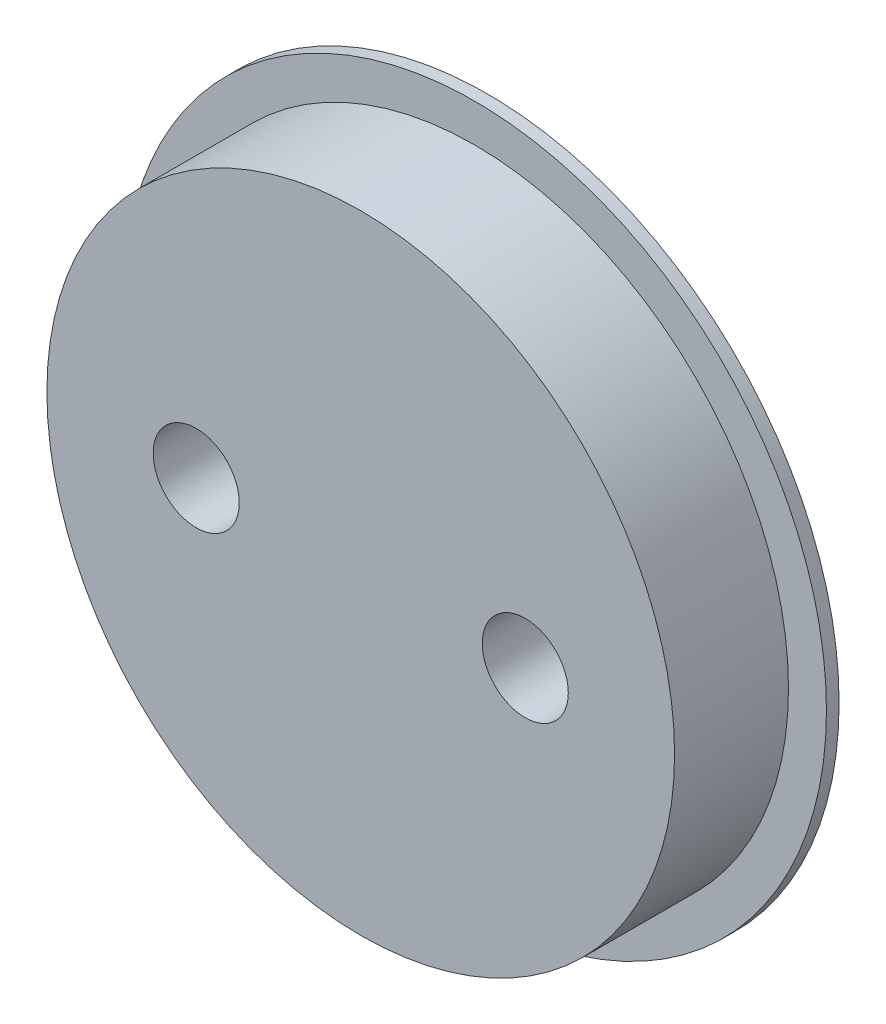
ISO-10303-21;
HEADER;
FILE_DESCRIPTION(('STEP AP214'),'2;1');
FILE_NAME('part.step','',(''),(''),'','','');
FILE_SCHEMA(('AUTOMOTIVE_DESIGN { 1 0 10303 214 1 1 1 1 }'));
ENDSEC;
DATA;
#1=APPLICATION_CONTEXT('core data for automotive mechanical design processes');
#2=APPLICATION_PROTOCOL_DEFINITION('international standard','automotive_design',2000,#1);
#3=PRODUCT_CONTEXT('',#1,'mechanical');
#4=PRODUCT('Part','Part','',(#3));
#5=PRODUCT_RELATED_PRODUCT_CATEGORY('part','',(#4));
#6=PRODUCT_DEFINITION_FORMATION('','',#4);
#7=PRODUCT_DEFINITION_CONTEXT('part definition',#1,'design');
#8=PRODUCT_DEFINITION('design','',#6,#7);
#9=PRODUCT_DEFINITION_SHAPE('','',#8);
#10=(LENGTH_UNIT() NAMED_UNIT(*) SI_UNIT(.MILLI.,.METRE.));
#11=(NAMED_UNIT(*) PLANE_ANGLE_UNIT() SI_UNIT($,.RADIAN.));
#12=(NAMED_UNIT(*) SI_UNIT($,.STERADIAN.) SOLID_ANGLE_UNIT());
#13=UNCERTAINTY_MEASURE_WITH_UNIT(LENGTH_MEASURE(1.E-05),#10,'distance_accuracy_value','');
#14=(GEOMETRIC_REPRESENTATION_CONTEXT(3) GLOBAL_UNCERTAINTY_ASSIGNED_CONTEXT((#13)) GLOBAL_UNIT_ASSIGNED_CONTEXT((#10,
#11,#12)) REPRESENTATION_CONTEXT('',''));
#15=CARTESIAN_POINT('',(0.,0.,0.));
#16=DIRECTION('',(0.,0.,1.));
#17=DIRECTION('',(1.,0.,0.));
#18=AXIS2_PLACEMENT_3D('',#15,#16,#17);
#19=CARTESIAN_POINT('',(0.,0.,5.));
#20=DIRECTION('',(0.,0.,1.));
#21=DIRECTION('',(1.,0.,0.));
#22=AXIS2_PLACEMENT_3D('',#19,#20,#21);
#23=PLANE('',#22);
#24=CARTESIAN_POINT('',(-6.5,0.,5.));
#25=DIRECTION('',(0.,0.,1.));
#26=DIRECTION('',(1.,0.,0.));
#27=AXIS2_PLACEMENT_3D('',#24,#25,#26);
#28=CIRCLE('',#27,1.7);
#29=CARTESIAN_POINT('',(-4.8,0.,5.));
#30=VERTEX_POINT('',#29);
#31=EDGE_CURVE('E51',#30,#30,#28,.T.);
#32=ORIENTED_EDGE('',*,*,#31,.F.);
#33=EDGE_LOOP('',(#32));
#34=FACE_BOUND('',#33,.T.);
#35=CARTESIAN_POINT('',(0.,0.,5.));
#36=DIRECTION('',(0.,0.,1.));
#37=DIRECTION('',(1.,0.,0.));
#38=AXIS2_PLACEMENT_3D('',#35,#36,#37);
#39=CIRCLE('',#38,12.4);
#40=CARTESIAN_POINT('',(12.4,0.,5.));
#41=VERTEX_POINT('',#40);
#42=EDGE_CURVE('E10',#41,#41,#39,.T.);
#43=ORIENTED_EDGE('',*,*,#42,.T.);
#44=EDGE_LOOP('',(#43));
#45=FACE_BOUND('',#44,.T.);
#46=CARTESIAN_POINT('',(6.5,0.,5.));
#47=DIRECTION('',(0.,0.,1.));
#48=DIRECTION('',(1.,0.,0.));
#49=AXIS2_PLACEMENT_3D('',#46,#47,#48);
#50=CIRCLE('',#49,1.7);
#51=CARTESIAN_POINT('',(8.2,0.,5.));
#52=VERTEX_POINT('',#51);
#53=EDGE_CURVE('E62',#52,#52,#50,.T.);
#54=ORIENTED_EDGE('',*,*,#53,.F.);
#55=EDGE_LOOP('',(#54));
#56=FACE_BOUND('',#55,.T.);
#57=ADVANCED_FACE('F43',(#34,#45,#56),#23,.T.);
#58=CARTESIAN_POINT('',(0.,0.,0.));
#59=DIRECTION('',(0.,0.,1.));
#60=DIRECTION('',(1.,0.,0.));
#61=AXIS2_PLACEMENT_3D('',#58,#59,#60);
#62=PLANE('',#61);
#63=CARTESIAN_POINT('',(-6.5,0.,0.));
#64=DIRECTION('',(0.,0.,1.));
#65=DIRECTION('',(1.,0.,0.));
#66=AXIS2_PLACEMENT_3D('',#63,#64,#65);
#67=CIRCLE('',#66,1.7);
#68=CARTESIAN_POINT('',(-4.8,0.,0.));
#69=VERTEX_POINT('',#68);
#70=EDGE_CURVE('E56',#69,#69,#67,.T.);
#71=ORIENTED_EDGE('',*,*,#70,.T.);
#72=EDGE_LOOP('',(#71));
#73=FACE_BOUND('',#72,.T.);
#74=CARTESIAN_POINT('',(6.5,0.,0.));
#75=DIRECTION('',(0.,0.,1.));
#76=DIRECTION('',(1.,0.,0.));
#77=AXIS2_PLACEMENT_3D('',#74,#75,#76);
#78=CIRCLE('',#77,1.7);
#79=CARTESIAN_POINT('',(8.2,0.,0.));
#80=VERTEX_POINT('',#79);
#81=EDGE_CURVE('E64',#80,#80,#78,.T.);
#82=ORIENTED_EDGE('',*,*,#81,.T.);
#83=EDGE_LOOP('',(#82));
#84=FACE_BOUND('',#83,.T.);
#85=CARTESIAN_POINT('',(0.,0.,0.));
#86=DIRECTION('',(0.,0.,1.));
#87=DIRECTION('',(1.,0.,0.));
#88=AXIS2_PLACEMENT_3D('',#85,#86,#87);
#89=CIRCLE('',#88,13.9);
#90=CARTESIAN_POINT('',(13.9,0.,0.));
#91=VERTEX_POINT('',#90);
#92=EDGE_CURVE('E72',#91,#91,#89,.T.);
#93=ORIENTED_EDGE('',*,*,#92,.F.);
#94=EDGE_LOOP('',(#93));
#95=FACE_BOUND('',#94,.T.);
#96=ADVANCED_FACE('F103',(#73,#84,#95),#62,.F.);
#97=CARTESIAN_POINT('',(0.,0.,5.));
#98=DIRECTION('',(0.,0.,-1.));
#99=DIRECTION('',(-1.,0.,0.));
#100=AXIS2_PLACEMENT_3D('',#97,#98,#99);
#101=CYLINDRICAL_SURFACE('',#100,12.4);
#102=CARTESIAN_POINT('',(0.,0.,0.5));
#103=DIRECTION('',(0.,0.,1.));
#104=DIRECTION('',(1.,0.,0.));
#105=AXIS2_PLACEMENT_3D('',#102,#103,#104);
#106=CIRCLE('',#105,12.4);
#107=CARTESIAN_POINT('',(12.4,0.,0.5));
#108=VERTEX_POINT('',#107);
#109=EDGE_CURVE('E76',#108,#108,#106,.T.);
#110=ORIENTED_EDGE('',*,*,#109,.T.);
#111=EDGE_LOOP('',(#110));
#112=FACE_BOUND('',#111,.T.);
#113=ORIENTED_EDGE('',*,*,#42,.F.);
#114=EDGE_LOOP('',(#113));
#115=FACE_BOUND('',#114,.T.);
#116=ADVANCED_FACE('F45',(#112,#115),#101,.T.);
#117=CARTESIAN_POINT('',(-6.5,0.,5.));
#118=DIRECTION('',(0.,0.,-1.));
#119=DIRECTION('',(-1.,0.,0.));
#120=AXIS2_PLACEMENT_3D('',#117,#118,#119);
#121=CYLINDRICAL_SURFACE('',#120,1.7);
#122=ORIENTED_EDGE('',*,*,#31,.T.);
#123=EDGE_LOOP('',(#122));
#124=FACE_BOUND('',#123,.T.);
#125=ORIENTED_EDGE('',*,*,#70,.F.);
#126=EDGE_LOOP('',(#125));
#127=FACE_BOUND('',#126,.T.);
#128=ADVANCED_FACE('F99',(#124,#127),#121,.F.);
#129=CARTESIAN_POINT('',(6.5,0.,5.));
#130=DIRECTION('',(0.,0.,-1.));
#131=DIRECTION('',(-1.,0.,0.));
#132=AXIS2_PLACEMENT_3D('',#129,#130,#131);
#133=CYLINDRICAL_SURFACE('',#132,1.7);
#134=ORIENTED_EDGE('',*,*,#53,.T.);
#135=EDGE_LOOP('',(#134));
#136=FACE_BOUND('',#135,.T.);
#137=ORIENTED_EDGE('',*,*,#81,.F.);
#138=EDGE_LOOP('',(#137));
#139=FACE_BOUND('',#138,.T.);
#140=ADVANCED_FACE('F89',(#136,#139),#133,.F.);
#141=CARTESIAN_POINT('',(0.,0.,0.5));
#142=DIRECTION('',(0.,0.,1.));
#143=DIRECTION('',(1.,0.,0.));
#144=AXIS2_PLACEMENT_3D('',#141,#142,#143);
#145=PLANE('',#144);
#146=CARTESIAN_POINT('',(0.,0.,0.5));
#147=DIRECTION('',(0.,0.,1.));
#148=DIRECTION('',(1.,0.,0.));
#149=AXIS2_PLACEMENT_3D('',#146,#147,#148);
#150=CIRCLE('',#149,13.9);
#151=CARTESIAN_POINT('',(13.9,0.,0.5));
#152=VERTEX_POINT('',#151);
#153=EDGE_CURVE('E68',#152,#152,#150,.T.);
#154=ORIENTED_EDGE('',*,*,#153,.T.);
#155=EDGE_LOOP('',(#154));
#156=FACE_BOUND('',#155,.T.);
#157=ORIENTED_EDGE('',*,*,#109,.F.);
#158=EDGE_LOOP('',(#157));
#159=FACE_BOUND('',#158,.T.);
#160=ADVANCED_FACE('F86',(#156,#159),#145,.T.);
#161=CARTESIAN_POINT('',(0.,0.,0.5));
#162=DIRECTION('',(0.,0.,-1.));
#163=DIRECTION('',(-1.,0.,0.));
#164=AXIS2_PLACEMENT_3D('',#161,#162,#163);
#165=CYLINDRICAL_SURFACE('',#164,13.9);
#166=ORIENTED_EDGE('',*,*,#153,.F.);
#167=EDGE_LOOP('',(#166));
#168=FACE_BOUND('',#167,.T.);
#169=ORIENTED_EDGE('',*,*,#92,.T.);
#170=EDGE_LOOP('',(#169));
#171=FACE_BOUND('',#170,.T.);
#172=ADVANCED_FACE('F88',(#168,#171),#165,.T.);
#173=CLOSED_SHELL('',(#57,#96,#116,#128,#140,#160,#172));
#174=MANIFOLD_SOLID_BREP('B2',#173);
#175=ADVANCED_BREP_SHAPE_REPRESENTATION('',(#18,#174),#14);
#176=SHAPE_DEFINITION_REPRESENTATION(#9,#175);
ENDSEC;
END-ISO-10303-21;
